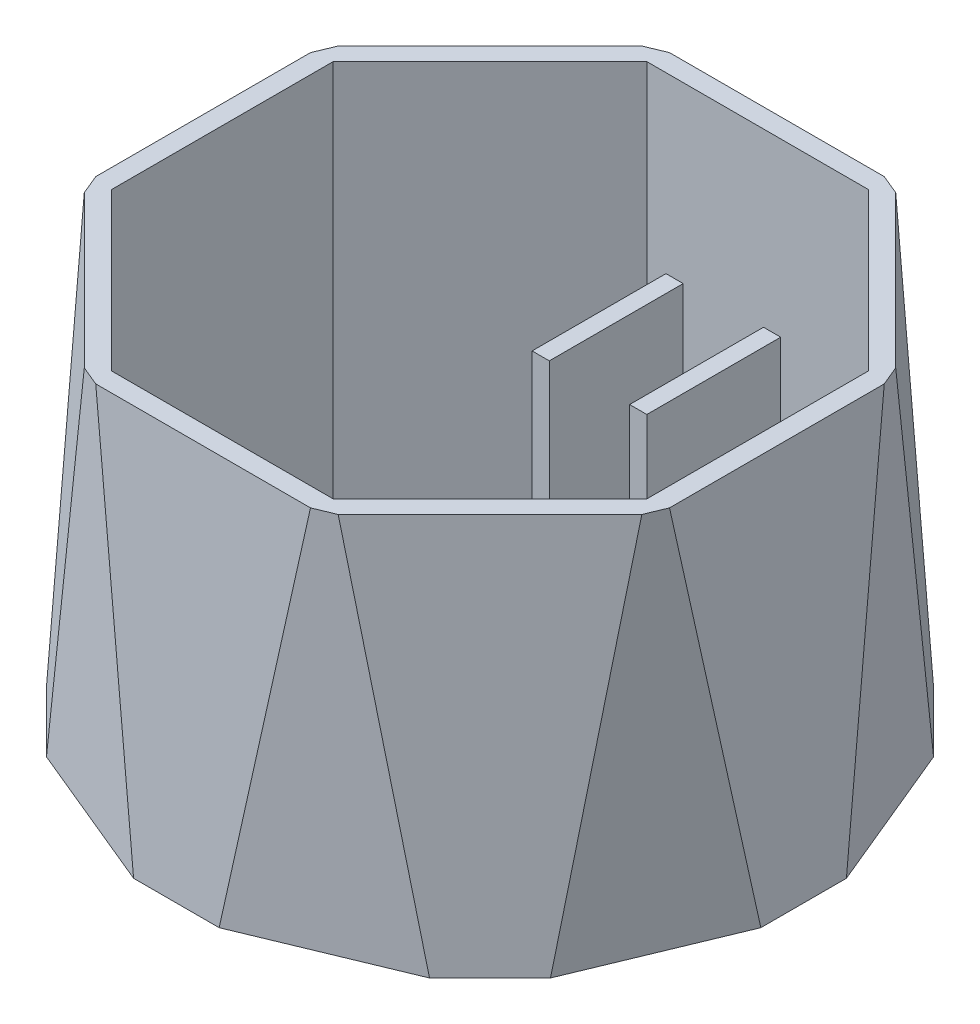
ISO-10303-21;
HEADER;
FILE_DESCRIPTION(('STEP AP214'),'2;1');
FILE_NAME('part.step','',(''),(''),'','','');
FILE_SCHEMA(('AUTOMOTIVE_DESIGN { 1 0 10303 214 1 1 1 1 }'));
ENDSEC;
DATA;
#1=APPLICATION_CONTEXT('core data for automotive mechanical design processes');
#2=APPLICATION_PROTOCOL_DEFINITION('international standard','automotive_design',2000,#1);
#3=PRODUCT_CONTEXT('',#1,'mechanical');
#4=PRODUCT('Part','Part','',(#3));
#5=PRODUCT_RELATED_PRODUCT_CATEGORY('part','',(#4));
#6=PRODUCT_DEFINITION_FORMATION('','',#4);
#7=PRODUCT_DEFINITION_CONTEXT('part definition',#1,'design');
#8=PRODUCT_DEFINITION('design','',#6,#7);
#9=PRODUCT_DEFINITION_SHAPE('','',#8);
#10=(LENGTH_UNIT() NAMED_UNIT(*) SI_UNIT(.MILLI.,.METRE.));
#11=(NAMED_UNIT(*) PLANE_ANGLE_UNIT() SI_UNIT($,.RADIAN.));
#12=(NAMED_UNIT(*) SI_UNIT($,.STERADIAN.) SOLID_ANGLE_UNIT());
#13=UNCERTAINTY_MEASURE_WITH_UNIT(LENGTH_MEASURE(1.E-05),#10,'distance_accuracy_value','');
#14=(GEOMETRIC_REPRESENTATION_CONTEXT(3) GLOBAL_UNCERTAINTY_ASSIGNED_CONTEXT((#13)) GLOBAL_UNIT_ASSIGNED_CONTEXT((#10,
#11,#12)) REPRESENTATION_CONTEXT('',''));
#15=CARTESIAN_POINT('',(0.,0.,0.));
#16=DIRECTION('',(0.,0.,1.));
#17=DIRECTION('',(1.,0.,0.));
#18=AXIS2_PLACEMENT_3D('',#15,#16,#17);
#19=CARTESIAN_POINT('',(0.,100.,-70.));
#20=DIRECTION('',(0.,0.,1.));
#21=DIRECTION('',(1.,0.,0.));
#22=AXIS2_PLACEMENT_3D('',#19,#20,#21);
#23=PLANE('',#22);
#24=DIRECTION('',(-1.,0.,0.));
#25=VECTOR('',#24,1.);
#26=CARTESIAN_POINT('',(6.00505063388332,55.1108574848862,-70.));
#27=LINE('',#26,#25);
#28=CARTESIAN_POINT('',(6.00505063388332,55.1108574848862,-70.));
#29=VERTEX_POINT('',#28);
#30=CARTESIAN_POINT('',(1.50505063388332,55.1108574848862,-70.));
#31=VERTEX_POINT('',#30);
#32=EDGE_CURVE('E878',#29,#31,#27,.T.);
#33=ORIENTED_EDGE('',*,*,#32,.F.);
#34=DIRECTION('',(0.,1.,0.));
#35=VECTOR('',#34,1.);
#36=CARTESIAN_POINT('',(6.00505063388332,0.610857484886179,-70.));
#37=LINE('',#36,#35);
#38=CARTESIAN_POINT('',(6.00505063388332,0.610857484886179,-70.));
#39=VERTEX_POINT('',#38);
#40=EDGE_CURVE('E881',#39,#29,#37,.T.);
#41=ORIENTED_EDGE('',*,*,#40,.F.);
#42=DIRECTION('',(1.,0.,0.));
#43=VECTOR('',#42,1.);
#44=CARTESIAN_POINT('',(6.00505063388332,0.610857484886179,-70.));
#45=LINE('',#44,#43);
#46=CARTESIAN_POINT('',(1.50505063388332,0.610857484886179,-70.));
#47=VERTEX_POINT('',#46);
#48=EDGE_CURVE('E871',#47,#39,#45,.T.);
#49=ORIENTED_EDGE('',*,*,#48,.F.);
#50=DIRECTION('',(0.,-1.,0.));
#51=VECTOR('',#50,1.);
#52=CARTESIAN_POINT('',(1.50505063388332,0.610857484886179,-70.));
#53=LINE('',#52,#51);
#54=EDGE_CURVE('E874',#31,#47,#53,.T.);
#55=ORIENTED_EDGE('',*,*,#54,.F.);
#56=EDGE_LOOP('',(#33,#41,#49,#55));
#57=FACE_BOUND('',#56,.T.);
#58=DIRECTION('',(-1.,0.,0.));
#59=VECTOR('',#58,1.);
#60=CARTESIAN_POINT('',(0.,0.,-70.));
#61=LINE('',#60,#59);
#62=CARTESIAN_POINT('',(-23.9949493661167,0.,-70.));
#63=VERTEX_POINT('',#62);
#64=CARTESIAN_POINT('',(-28.9949493661167,0.,-70.));
#65=VERTEX_POINT('',#64);
#66=EDGE_CURVE('E346',#63,#65,#61,.T.);
#67=ORIENTED_EDGE('',*,*,#66,.F.);
#68=DIRECTION('',(0.,-1.,0.));
#69=VECTOR('',#68,1.);
#70=CARTESIAN_POINT('',(-23.9949493661167,0.,-70.));
#71=LINE('',#70,#69);
#72=CARTESIAN_POINT('',(-23.9949493661167,54.5,-70.));
#73=VERTEX_POINT('',#72);
#74=EDGE_CURVE('E849',#73,#63,#71,.T.);
#75=ORIENTED_EDGE('',*,*,#74,.F.);
#76=DIRECTION('',(-1.,0.,0.));
#77=VECTOR('',#76,1.);
#78=CARTESIAN_POINT('',(-23.9949493661167,54.5,-70.));
#79=LINE('',#78,#77);
#80=CARTESIAN_POINT('',(-19.4949493661167,54.5,-70.));
#81=VERTEX_POINT('',#80);
#82=EDGE_CURVE('E846',#81,#73,#79,.T.);
#83=ORIENTED_EDGE('',*,*,#82,.F.);
#84=DIRECTION('',(0.,1.,0.));
#85=VECTOR('',#84,1.);
#86=CARTESIAN_POINT('',(-19.4949493661167,0.,-70.));
#87=LINE('',#86,#85);
#88=CARTESIAN_POINT('',(-19.4949493661167,0.,-70.));
#89=VERTEX_POINT('',#88);
#90=EDGE_CURVE('E948',#89,#81,#87,.T.);
#91=ORIENTED_EDGE('',*,*,#90,.F.);
#92=CARTESIAN_POINT('',(28.9949493661166,0.,-70.));
#93=VERTEX_POINT('',#92);
#94=EDGE_CURVE('E347',#93,#89,#61,.T.);
#95=ORIENTED_EDGE('',*,*,#94,.F.);
#96=DIRECTION('',(0.,-1.,0.));
#97=VECTOR('',#96,1.);
#98=CARTESIAN_POINT('',(28.9949493661166,100.,-70.));
#99=LINE('',#98,#97);
#100=CARTESIAN_POINT('',(28.9949493661166,100.,-70.));
#101=VERTEX_POINT('',#100);
#102=EDGE_CURVE('E365',#101,#93,#99,.T.);
#103=ORIENTED_EDGE('',*,*,#102,.F.);
#104=DIRECTION('',(-1.,0.,0.));
#105=VECTOR('',#104,1.);
#106=CARTESIAN_POINT('',(0.,100.,-70.));
#107=LINE('',#106,#105);
#108=CARTESIAN_POINT('',(-28.9949493661167,100.,-70.));
#109=VERTEX_POINT('',#108);
#110=EDGE_CURVE('E914',#101,#109,#107,.T.);
#111=ORIENTED_EDGE('',*,*,#110,.T.);
#112=DIRECTION('',(0.,-1.,0.));
#113=VECTOR('',#112,1.);
#114=CARTESIAN_POINT('',(-28.9949493661167,100.,-70.));
#115=LINE('',#114,#113);
#116=EDGE_CURVE('E369',#109,#65,#115,.T.);
#117=ORIENTED_EDGE('',*,*,#116,.T.);
#118=EDGE_LOOP('',(#67,#75,#83,#91,#95,#103,#111,#117));
#119=FACE_BOUND('',#118,.T.);
#120=ADVANCED_FACE('F49',(#57,#119),#23,.T.);
#121=CARTESIAN_POINT('',(0.,100.,75.));
#122=DIRECTION('',(0.,0.0697564737441255,0.997564050259824));
#123=DIRECTION('',(0.,-0.997564050259824,0.0697564737441255));
#124=AXIS2_PLACEMENT_3D('',#121,#122,#123);
#125=PLANE('',#124);
#126=DIRECTION('',(1.,0.,0.));
#127=VECTOR('',#126,1.);
#128=CARTESIAN_POINT('',(0.,100.,75.));
#129=LINE('',#128,#127);
#130=CARTESIAN_POINT('',(-28.0660171779821,100.,75.));
#131=VERTEX_POINT('',#130);
#132=CARTESIAN_POINT('',(28.0660171779821,100.,75.));
#133=VERTEX_POINT('',#132);
#134=EDGE_CURVE('E422',#131,#133,#129,.T.);
#135=ORIENTED_EDGE('',*,*,#134,.F.);
#136=DIRECTION('',(0.166068560234038,-0.983712084404491,0.0687878499327116));
#137=VECTOR('',#136,1.);
#138=CARTESIAN_POINT('',(-28.0660171779821,100.,75.));
#139=LINE('',#138,#137);
#140=CARTESIAN_POINT('',(-11.1841914012285,0.,81.9926811943511));
#141=VERTEX_POINT('',#140);
#142=EDGE_CURVE('E258',#131,#141,#139,.T.);
#143=ORIENTED_EDGE('',*,*,#142,.T.);
#144=DIRECTION('',(-1.,0.,0.));
#145=VECTOR('',#144,1.);
#146=CARTESIAN_POINT('',(0.,0.,81.9926811943511));
#147=LINE('',#146,#145);
#148=CARTESIAN_POINT('',(11.1841914012283,0.,81.9926811943511));
#149=VERTEX_POINT('',#148);
#150=EDGE_CURVE('E262',#141,#149,#147,.F.);
#151=ORIENTED_EDGE('',*,*,#150,.T.);
#152=DIRECTION('',(0.166068560234039,0.983712084404491,-0.0687878499327117));
#153=VECTOR('',#152,1.);
#154=CARTESIAN_POINT('',(28.2314897781713,100.980181897251,74.9314590048005));
#155=LINE('',#154,#153);
#156=EDGE_CURVE('E266',#149,#133,#155,.T.);
#157=ORIENTED_EDGE('',*,*,#156,.T.);
#158=EDGE_LOOP('',(#135,#143,#151,#157));
#159=FACE_BOUND('',#158,.T.);
#160=ADVANCED_FACE('F437',(#159),#125,.T.);
#161=CARTESIAN_POINT('',(53.0330085889911,100.,53.0330085889911));
#162=DIRECTION('',(0.70538430460664,0.0697564737441255,0.70538430460664));
#163=DIRECTION('',(0.707106781186548,0.,-0.707106781186548));
#164=AXIS2_PLACEMENT_3D('',#161,#162,#163);
#165=PLANE('',#164);
#166=DIRECTION('',(0.707106781186547,0.,-0.707106781186548));
#167=VECTOR('',#166,1.);
#168=CARTESIAN_POINT('',(53.0330085889911,100.,53.0330085889911));
#169=LINE('',#168,#167);
#170=CARTESIAN_POINT('',(33.1873375215418,100.,72.8786796564403));
#171=VERTEX_POINT('',#170);
#172=CARTESIAN_POINT('',(72.8786796564404,100.,33.1873375215418));
#173=VERTEX_POINT('',#172);
#174=EDGE_CURVE('E419',#171,#173,#169,.T.);
#175=ORIENTED_EDGE('',*,*,#174,.F.);
#176=DIRECTION('',(0.166068560234037,-0.983712084404491,-0.0687878499327106));
#177=VECTOR('',#176,1.);
#178=CARTESIAN_POINT('',(33.1873375215418,100.,72.8786796564403));
#179=LINE('',#178,#177);
#180=CARTESIAN_POINT('',(50.0691632982953,0.,65.8859984620894));
#181=VERTEX_POINT('',#180);
#182=EDGE_CURVE('E250',#171,#181,#179,.T.);
#183=ORIENTED_EDGE('',*,*,#182,.T.);
#184=DIRECTION('',(-0.707106781186548,0.,0.707106781186548));
#185=VECTOR('',#184,1.);
#186=CARTESIAN_POINT('',(57.9775808801924,0.,57.9775808801923));
#187=LINE('',#186,#185);
#188=CARTESIAN_POINT('',(65.8859984620894,0.,50.0691632982953));
#189=VERTEX_POINT('',#188);
#190=EDGE_CURVE('E253',#181,#189,#187,.F.);
#191=ORIENTED_EDGE('',*,*,#190,.T.);
#192=DIRECTION('',(0.0687878499327108,0.983712084404491,-0.166068560234037));
#193=VECTOR('',#192,1.);
#194=CARTESIAN_POINT('',(72.9472206516399,100.980181897251,33.0218649213526));
#195=LINE('',#194,#193);
#196=EDGE_CURVE('E255',#189,#173,#195,.T.);
#197=ORIENTED_EDGE('',*,*,#196,.T.);
#198=EDGE_LOOP('',(#175,#183,#191,#197));
#199=FACE_BOUND('',#198,.T.);
#200=ADVANCED_FACE('F427',(#199),#165,.T.);
#201=CARTESIAN_POINT('',(75.,100.,0.));
#202=DIRECTION('',(0.997564050259824,0.0697564737441255,0.));
#203=DIRECTION('',(-0.0697564737441255,0.997564050259824,0.));
#204=AXIS2_PLACEMENT_3D('',#201,#202,#203);
#205=PLANE('',#204);
#206=DIRECTION('',(0.,0.,-1.));
#207=VECTOR('',#206,1.);
#208=CARTESIAN_POINT('',(75.,100.,0.));
#209=LINE('',#208,#207);
#210=CARTESIAN_POINT('',(75.,100.,28.0660171779821));
#211=VERTEX_POINT('',#210);
#212=CARTESIAN_POINT('',(75.,100.,-28.0660171779822));
#213=VERTEX_POINT('',#212);
#214=EDGE_CURVE('E431',#211,#213,#209,.T.);
#215=ORIENTED_EDGE('',*,*,#214,.F.);
#216=DIRECTION('',(0.0687878499327115,-0.983712084404491,-0.166068560234039));
#217=VECTOR('',#216,1.);
#218=CARTESIAN_POINT('',(75.,100.,28.0660171779821));
#219=LINE('',#218,#217);
#220=CARTESIAN_POINT('',(81.9926811943511,0.,11.1841914012284));
#221=VERTEX_POINT('',#220);
#222=EDGE_CURVE('E11',#211,#221,#219,.T.);
#223=ORIENTED_EDGE('',*,*,#222,.T.);
#224=DIRECTION('',(0.,0.,1.));
#225=VECTOR('',#224,1.);
#226=CARTESIAN_POINT('',(81.9926811943511,0.,0.));
#227=LINE('',#226,#225);
#228=CARTESIAN_POINT('',(81.9926811943511,0.,-11.1841914012284));
#229=VERTEX_POINT('',#228);
#230=EDGE_CURVE('E239',#221,#229,#227,.F.);
#231=ORIENTED_EDGE('',*,*,#230,.T.);
#232=DIRECTION('',(-0.0687878499327117,0.983712084404491,-0.166068560234039));
#233=VECTOR('',#232,1.);
#234=CARTESIAN_POINT('',(74.9314590048005,100.980181897251,-28.2314897781714));
#235=LINE('',#234,#233);
#236=EDGE_CURVE('E60',#229,#213,#235,.T.);
#237=ORIENTED_EDGE('',*,*,#236,.T.);
#238=EDGE_LOOP('',(#215,#223,#231,#237));
#239=FACE_BOUND('',#238,.T.);
#240=ADVANCED_FACE('F51',(#239),#205,.T.);
#241=CARTESIAN_POINT('',(53.0330085889911,100.,-53.0330085889911));
#242=DIRECTION('',(0.705384304606639,0.0697564737441255,-0.70538430460664));
#243=DIRECTION('',(-0.707106781186548,0.,-0.707106781186547));
#244=AXIS2_PLACEMENT_3D('',#241,#242,#243);
#245=PLANE('',#244);
#246=DIRECTION('',(0.707106781186548,0.,0.707106781186547));
#247=VECTOR('',#246,1.);
#248=CARTESIAN_POINT('',(57.9775808801923,0.,-57.9775808801924));
#249=LINE('',#248,#247);
#250=CARTESIAN_POINT('',(65.8859984620894,0.,-50.0691632982953));
#251=VERTEX_POINT('',#250);
#252=CARTESIAN_POINT('',(50.0691632982954,0.,-65.8859984620893));
#253=VERTEX_POINT('',#252);
#254=EDGE_CURVE('E234',#251,#253,#249,.F.);
#255=ORIENTED_EDGE('',*,*,#254,.T.);
#256=DIRECTION('',(-0.166068560234038,0.983712084404491,-0.0687878499327116));
#257=VECTOR('',#256,1.);
#258=CARTESIAN_POINT('',(33.0218649213525,100.980181897251,-72.9472206516399));
#259=LINE('',#258,#257);
#260=CARTESIAN_POINT('',(33.1873375215418,100.,-72.8786796564404));
#261=VERTEX_POINT('',#260);
#262=EDGE_CURVE('E244',#253,#261,#259,.T.);
#263=ORIENTED_EDGE('',*,*,#262,.T.);
#264=DIRECTION('',(-0.707106781186548,0.,-0.707106781186547));
#265=VECTOR('',#264,1.);
#266=CARTESIAN_POINT('',(53.0330085889911,100.,-53.0330085889911));
#267=LINE('',#266,#265);
#268=CARTESIAN_POINT('',(72.8786796564404,100.,-33.1873375215418));
#269=VERTEX_POINT('',#268);
#270=EDGE_CURVE('E318',#269,#261,#267,.T.);
#271=ORIENTED_EDGE('',*,*,#270,.F.);
#272=DIRECTION('',(-0.068787849932711,-0.983712084404491,-0.166068560234037));
#273=VECTOR('',#272,1.);
#274=CARTESIAN_POINT('',(72.8786796564404,100.,-33.1873375215418));
#275=LINE('',#274,#273);
#276=EDGE_CURVE('E240',#269,#251,#275,.T.);
#277=ORIENTED_EDGE('',*,*,#276,.T.);
#278=EDGE_LOOP('',(#255,#263,#271,#277));
#279=FACE_BOUND('',#278,.T.);
#280=ADVANCED_FACE('F539',(#279),#245,.T.);
#281=CARTESIAN_POINT('',(0.,100.,-75.));
#282=DIRECTION('',(0.,0.0697564737441255,-0.997564050259824));
#283=DIRECTION('',(0.,0.997564050259824,0.0697564737441255));
#284=AXIS2_PLACEMENT_3D('',#281,#282,#283);
#285=PLANE('',#284);
#286=DIRECTION('',(-1.,0.,0.));
#287=VECTOR('',#286,1.);
#288=CARTESIAN_POINT('',(0.,100.,-75.));
#289=LINE('',#288,#287);
#290=CARTESIAN_POINT('',(28.0660171779821,100.,-75.));
#291=VERTEX_POINT('',#290);
#292=CARTESIAN_POINT('',(-28.0660171779822,100.,-75.));
#293=VERTEX_POINT('',#292);
#294=EDGE_CURVE('E311',#291,#293,#289,.T.);
#295=ORIENTED_EDGE('',*,*,#294,.F.);
#296=DIRECTION('',(-0.166068560234038,-0.983712084404491,-0.0687878499327116));
#297=VECTOR('',#296,1.);
#298=CARTESIAN_POINT('',(28.0660171779821,100.,-75.));
#299=LINE('',#298,#297);
#300=CARTESIAN_POINT('',(11.1841914012285,0.,-81.9926811943511));
#301=VERTEX_POINT('',#300);
#302=EDGE_CURVE('E53',#291,#301,#299,.T.);
#303=ORIENTED_EDGE('',*,*,#302,.T.);
#304=DIRECTION('',(1.,0.,0.));
#305=VECTOR('',#304,1.);
#306=CARTESIAN_POINT('',(0.,0.,-81.9926811943511));
#307=LINE('',#306,#305);
#308=CARTESIAN_POINT('',(-11.1841914012287,0.,-81.9926811943511));
#309=VERTEX_POINT('',#308);
#310=EDGE_CURVE('E238',#301,#309,#307,.F.);
#311=ORIENTED_EDGE('',*,*,#310,.T.);
#312=DIRECTION('',(-0.166068560234037,0.983712084404491,0.0687878499327117));
#313=VECTOR('',#312,1.);
#314=CARTESIAN_POINT('',(-28.2314897781714,100.980181897251,-74.9314590048005));
#315=LINE('',#314,#313);
#316=EDGE_CURVE('E297',#309,#293,#315,.T.);
#317=ORIENTED_EDGE('',*,*,#316,.T.);
#318=EDGE_LOOP('',(#295,#303,#311,#317));
#319=FACE_BOUND('',#318,.T.);
#320=ADVANCED_FACE('F304',(#319),#285,.T.);
#321=CARTESIAN_POINT('',(-53.0330085889911,100.,-53.0330085889911));
#322=DIRECTION('',(-0.70538430460664,0.0697564737441255,-0.705384304606639));
#323=DIRECTION('',(-0.707106781186547,0.,0.707106781186548));
#324=AXIS2_PLACEMENT_3D('',#321,#322,#323);
#325=PLANE('',#324);
#326=DIRECTION('',(-0.707106781186547,0.,0.707106781186548));
#327=VECTOR('',#326,1.);
#328=CARTESIAN_POINT('',(-53.0330085889911,100.,-53.0330085889911));
#329=LINE('',#328,#327);
#330=CARTESIAN_POINT('',(-33.1873375215418,100.,-72.8786796564404));
#331=VERTEX_POINT('',#330);
#332=CARTESIAN_POINT('',(-72.8786796564404,100.,-33.1873375215418));
#333=VERTEX_POINT('',#332);
#334=EDGE_CURVE('E211',#331,#333,#329,.T.);
#335=ORIENTED_EDGE('',*,*,#334,.F.);
#336=DIRECTION('',(-0.166068560234038,-0.983712084404491,0.0687878499327122));
#337=VECTOR('',#336,1.);
#338=CARTESIAN_POINT('',(-33.1873375215418,100.,-72.8786796564404));
#339=LINE('',#338,#337);
#340=CARTESIAN_POINT('',(-50.0691632982955,0.,-65.8859984620892));
#341=VERTEX_POINT('',#340);
#342=EDGE_CURVE('E200',#331,#341,#339,.T.);
#343=ORIENTED_EDGE('',*,*,#342,.T.);
#344=DIRECTION('',(0.707106781186547,0.,-0.707106781186548));
#345=VECTOR('',#344,1.);
#346=CARTESIAN_POINT('',(-57.9775808801924,0.,-57.9775808801923));
#347=LINE('',#346,#345);
#348=CARTESIAN_POINT('',(-65.8859984620894,0.,-50.0691632982953));
#349=VERTEX_POINT('',#348);
#350=EDGE_CURVE('E286',#341,#349,#347,.F.);
#351=ORIENTED_EDGE('',*,*,#350,.T.);
#352=DIRECTION('',(-0.0687878499327108,0.983712084404491,0.166068560234037));
#353=VECTOR('',#352,1.);
#354=CARTESIAN_POINT('',(-72.9472206516399,100.980181897251,-33.0218649213525));
#355=LINE('',#354,#353);
#356=EDGE_CURVE('E233',#349,#333,#355,.T.);
#357=ORIENTED_EDGE('',*,*,#356,.T.);
#358=EDGE_LOOP('',(#335,#343,#351,#357));
#359=FACE_BOUND('',#358,.T.);
#360=ADVANCED_FACE('F313',(#359),#325,.T.);
#361=CARTESIAN_POINT('',(-75.,100.,0.));
#362=DIRECTION('',(-0.997564050259824,0.0697564737441255,0.));
#363=DIRECTION('',(-0.0697564737441255,-0.997564050259824,0.));
#364=AXIS2_PLACEMENT_3D('',#361,#362,#363);
#365=PLANE('',#364);
#366=DIRECTION('',(0.,0.,1.));
#367=VECTOR('',#366,1.);
#368=CARTESIAN_POINT('',(-75.,100.,0.));
#369=LINE('',#368,#367);
#370=CARTESIAN_POINT('',(-75.,100.,-28.0660171779821));
#371=VERTEX_POINT('',#370);
#372=CARTESIAN_POINT('',(-75.,100.,28.0660171779821));
#373=VERTEX_POINT('',#372);
#374=EDGE_CURVE('E192',#371,#373,#369,.T.);
#375=ORIENTED_EDGE('',*,*,#374,.F.);
#376=DIRECTION('',(-0.0687878499327116,-0.983712084404491,0.166068560234039));
#377=VECTOR('',#376,1.);
#378=CARTESIAN_POINT('',(-75.,100.,-28.0660171779821));
#379=LINE('',#378,#377);
#380=CARTESIAN_POINT('',(-81.9926811943511,0.,-11.1841914012284));
#381=VERTEX_POINT('',#380);
#382=EDGE_CURVE('E199',#371,#381,#379,.T.);
#383=ORIENTED_EDGE('',*,*,#382,.T.);
#384=DIRECTION('',(0.,0.,-1.));
#385=VECTOR('',#384,1.);
#386=CARTESIAN_POINT('',(-81.9926811943511,0.,0.));
#387=LINE('',#386,#385);
#388=CARTESIAN_POINT('',(-81.9926811943511,0.,11.1841914012284));
#389=VERTEX_POINT('',#388);
#390=EDGE_CURVE('E195',#381,#389,#387,.F.);
#391=ORIENTED_EDGE('',*,*,#390,.T.);
#392=DIRECTION('',(0.0687878499327117,0.983712084404491,0.166068560234039));
#393=VECTOR('',#392,1.);
#394=CARTESIAN_POINT('',(-74.9314590048005,100.980181897251,28.2314897781714));
#395=LINE('',#394,#393);
#396=EDGE_CURVE('E188',#389,#373,#395,.T.);
#397=ORIENTED_EDGE('',*,*,#396,.T.);
#398=EDGE_LOOP('',(#375,#383,#391,#397));
#399=FACE_BOUND('',#398,.T.);
#400=ADVANCED_FACE('F190',(#399),#365,.T.);
#401=CARTESIAN_POINT('',(49.4974746830583,100.,49.4974746830583));
#402=DIRECTION('',(-0.707106781186548,0.,-0.707106781186547));
#403=DIRECTION('',(-0.707106781186547,0.,0.707106781186548));
#404=AXIS2_PLACEMENT_3D('',#401,#402,#403);
#405=PLANE('',#404);
#406=DIRECTION('',(0.707106781186547,0.,-0.707106781186548));
#407=VECTOR('',#406,1.);
#408=CARTESIAN_POINT('',(49.4974746830583,0.,49.4974746830583));
#409=LINE('',#408,#407);
#410=CARTESIAN_POINT('',(28.9949493661167,0.,70.));
#411=VERTEX_POINT('',#410);
#412=CARTESIAN_POINT('',(70.,0.,28.9949493661166));
#413=VERTEX_POINT('',#412);
#414=EDGE_CURVE('E325',#411,#413,#409,.T.);
#415=ORIENTED_EDGE('',*,*,#414,.F.);
#416=DIRECTION('',(0.,-1.,0.));
#417=VECTOR('',#416,1.);
#418=CARTESIAN_POINT('',(28.9949493661167,100.,70.));
#419=LINE('',#418,#417);
#420=CARTESIAN_POINT('',(28.9949493661167,100.,70.));
#421=VERTEX_POINT('',#420);
#422=EDGE_CURVE('E299',#421,#411,#419,.T.);
#423=ORIENTED_EDGE('',*,*,#422,.F.);
#424=DIRECTION('',(0.707106781186547,0.,-0.707106781186548));
#425=VECTOR('',#424,1.);
#426=CARTESIAN_POINT('',(49.4974746830583,100.,49.4974746830583));
#427=LINE('',#426,#425);
#428=CARTESIAN_POINT('',(70.,100.,28.9949493661166));
#429=VERTEX_POINT('',#428);
#430=EDGE_CURVE('E281',#421,#429,#427,.T.);
#431=ORIENTED_EDGE('',*,*,#430,.T.);
#432=DIRECTION('',(0.,-1.,0.));
#433=VECTOR('',#432,1.);
#434=CARTESIAN_POINT('',(70.,100.,28.9949493661166));
#435=LINE('',#434,#433);
#436=EDGE_CURVE('E324',#429,#413,#435,.T.);
#437=ORIENTED_EDGE('',*,*,#436,.T.);
#438=EDGE_LOOP('',(#415,#423,#431,#437));
#439=FACE_BOUND('',#438,.T.);
#440=ADVANCED_FACE('F486',(#439),#405,.T.);
#441=CARTESIAN_POINT('',(0.,100.,70.));
#442=DIRECTION('',(0.,0.,-1.));
#443=DIRECTION('',(-1.,0.,0.));
#444=AXIS2_PLACEMENT_3D('',#441,#442,#443);
#445=PLANE('',#444);
#446=DIRECTION('',(1.,0.,0.));
#447=VECTOR('',#446,1.);
#448=CARTESIAN_POINT('',(0.,0.,70.));
#449=LINE('',#448,#447);
#450=CARTESIAN_POINT('',(-28.9949493661167,0.,70.));
#451=VERTEX_POINT('',#450);
#452=EDGE_CURVE('E329',#451,#411,#449,.T.);
#453=ORIENTED_EDGE('',*,*,#452,.F.);
#454=DIRECTION('',(0.,-1.,0.));
#455=VECTOR('',#454,1.);
#456=CARTESIAN_POINT('',(-28.9949493661167,100.,70.));
#457=LINE('',#456,#455);
#458=CARTESIAN_POINT('',(-28.9949493661167,100.,70.));
#459=VERTEX_POINT('',#458);
#460=EDGE_CURVE('E381',#459,#451,#457,.T.);
#461=ORIENTED_EDGE('',*,*,#460,.F.);
#462=DIRECTION('',(1.,0.,0.));
#463=VECTOR('',#462,1.);
#464=CARTESIAN_POINT('',(0.,100.,70.));
#465=LINE('',#464,#463);
#466=EDGE_CURVE('E898',#459,#421,#465,.T.);
#467=ORIENTED_EDGE('',*,*,#466,.T.);
#468=ORIENTED_EDGE('',*,*,#422,.T.);
#469=EDGE_LOOP('',(#453,#461,#467,#468));
#470=FACE_BOUND('',#469,.T.);
#471=ADVANCED_FACE('F482',(#470),#445,.T.);
#472=CARTESIAN_POINT('',(-49.4974746830583,100.,49.4974746830584));
#473=DIRECTION('',(0.707106781186547,0.,-0.707106781186548));
#474=DIRECTION('',(-0.707106781186548,0.,-0.707106781186547));
#475=AXIS2_PLACEMENT_3D('',#472,#473,#474);
#476=PLANE('',#475);
#477=DIRECTION('',(0.707106781186548,0.,0.707106781186547));
#478=VECTOR('',#477,1.);
#479=CARTESIAN_POINT('',(-49.4974746830583,0.,49.4974746830584));
#480=LINE('',#479,#478);
#481=CARTESIAN_POINT('',(-70.,0.,28.9949493661167));
#482=VERTEX_POINT('',#481);
#483=EDGE_CURVE('E334',#482,#451,#480,.T.);
#484=ORIENTED_EDGE('',*,*,#483,.F.);
#485=DIRECTION('',(0.,-1.,0.));
#486=VECTOR('',#485,1.);
#487=CARTESIAN_POINT('',(-70.,100.,28.9949493661167));
#488=LINE('',#487,#486);
#489=CARTESIAN_POINT('',(-70.,100.,28.9949493661167));
#490=VERTEX_POINT('',#489);
#491=EDGE_CURVE('E377',#490,#482,#488,.T.);
#492=ORIENTED_EDGE('',*,*,#491,.F.);
#493=DIRECTION('',(0.707106781186548,0.,0.707106781186547));
#494=VECTOR('',#493,1.);
#495=CARTESIAN_POINT('',(-49.4974746830583,100.,49.4974746830584));
#496=LINE('',#495,#494);
#497=EDGE_CURVE('E902',#490,#459,#496,.T.);
#498=ORIENTED_EDGE('',*,*,#497,.T.);
#499=ORIENTED_EDGE('',*,*,#460,.T.);
#500=EDGE_LOOP('',(#484,#492,#498,#499));
#501=FACE_BOUND('',#500,.T.);
#502=ADVANCED_FACE('F478',(#501),#476,.T.);
#503=CARTESIAN_POINT('',(-70.,100.,0.));
#504=DIRECTION('',(1.,0.,0.));
#505=DIRECTION('',(0.,0.,-1.));
#506=AXIS2_PLACEMENT_3D('',#503,#504,#505);
#507=PLANE('',#506);
#508=DIRECTION('',(0.,0.,1.));
#509=VECTOR('',#508,1.);
#510=CARTESIAN_POINT('',(-70.,0.,0.));
#511=LINE('',#510,#509);
#512=CARTESIAN_POINT('',(-70.,0.,-28.9949493661166));
#513=VERTEX_POINT('',#512);
#514=EDGE_CURVE('E338',#513,#482,#511,.T.);
#515=ORIENTED_EDGE('',*,*,#514,.F.);
#516=DIRECTION('',(0.,-1.,0.));
#517=VECTOR('',#516,1.);
#518=CARTESIAN_POINT('',(-70.,100.,-28.9949493661166));
#519=LINE('',#518,#517);
#520=CARTESIAN_POINT('',(-70.,100.,-28.9949493661166));
#521=VERTEX_POINT('',#520);
#522=EDGE_CURVE('E373',#521,#513,#519,.T.);
#523=ORIENTED_EDGE('',*,*,#522,.F.);
#524=DIRECTION('',(0.,0.,1.));
#525=VECTOR('',#524,1.);
#526=CARTESIAN_POINT('',(-70.,100.,0.));
#527=LINE('',#526,#525);
#528=EDGE_CURVE('E906',#521,#490,#527,.T.);
#529=ORIENTED_EDGE('',*,*,#528,.T.);
#530=ORIENTED_EDGE('',*,*,#491,.T.);
#531=EDGE_LOOP('',(#515,#523,#529,#530));
#532=FACE_BOUND('',#531,.T.);
#533=ADVANCED_FACE('F474',(#532),#507,.T.);
#534=CARTESIAN_POINT('',(-49.4974746830584,100.,-49.4974746830583));
#535=DIRECTION('',(0.707106781186548,0.,0.707106781186547));
#536=DIRECTION('',(0.707106781186547,0.,-0.707106781186548));
#537=AXIS2_PLACEMENT_3D('',#534,#535,#536);
#538=PLANE('',#537);
#539=DIRECTION('',(-0.707106781186547,0.,0.707106781186548));
#540=VECTOR('',#539,1.);
#541=CARTESIAN_POINT('',(-49.4974746830584,0.,-49.4974746830583));
#542=LINE('',#541,#540);
#543=EDGE_CURVE('E342',#65,#513,#542,.T.);
#544=ORIENTED_EDGE('',*,*,#543,.F.);
#545=ORIENTED_EDGE('',*,*,#116,.F.);
#546=DIRECTION('',(-0.707106781186547,0.,0.707106781186548));
#547=VECTOR('',#546,1.);
#548=CARTESIAN_POINT('',(-49.4974746830584,100.,-49.4974746830583));
#549=LINE('',#548,#547);
#550=EDGE_CURVE('E910',#109,#521,#549,.T.);
#551=ORIENTED_EDGE('',*,*,#550,.T.);
#552=ORIENTED_EDGE('',*,*,#522,.T.);
#553=EDGE_LOOP('',(#544,#545,#551,#552));
#554=FACE_BOUND('',#553,.T.);
#555=ADVANCED_FACE('F471',(#554),#538,.T.);
#556=CARTESIAN_POINT('',(49.4974746830583,100.,-49.4974746830583));
#557=DIRECTION('',(-0.707106781186547,0.,0.707106781186548));
#558=DIRECTION('',(0.707106781186548,0.,0.707106781186547));
#559=AXIS2_PLACEMENT_3D('',#556,#557,#558);
#560=PLANE('',#559);
#561=DIRECTION('',(-0.707106781186548,0.,-0.707106781186547));
#562=VECTOR('',#561,1.);
#563=CARTESIAN_POINT('',(49.4974746830583,0.,-49.4974746830583));
#564=LINE('',#563,#562);
#565=CARTESIAN_POINT('',(70.,0.,-28.9949493661167));
#566=VERTEX_POINT('',#565);
#567=EDGE_CURVE('E351',#566,#93,#564,.T.);
#568=ORIENTED_EDGE('',*,*,#567,.F.);
#569=DIRECTION('',(0.,-1.,0.));
#570=VECTOR('',#569,1.);
#571=CARTESIAN_POINT('',(70.,100.,-28.9949493661167));
#572=LINE('',#571,#570);
#573=CARTESIAN_POINT('',(70.,100.,-28.9949493661167));
#574=VERTEX_POINT('',#573);
#575=EDGE_CURVE('E361',#574,#566,#572,.T.);
#576=ORIENTED_EDGE('',*,*,#575,.F.);
#577=DIRECTION('',(-0.707106781186548,0.,-0.707106781186547));
#578=VECTOR('',#577,1.);
#579=CARTESIAN_POINT('',(49.4974746830583,100.,-49.4974746830583));
#580=LINE('',#579,#578);
#581=EDGE_CURVE('E918',#574,#101,#580,.T.);
#582=ORIENTED_EDGE('',*,*,#581,.T.);
#583=ORIENTED_EDGE('',*,*,#102,.T.);
#584=EDGE_LOOP('',(#568,#576,#582,#583));
#585=FACE_BOUND('',#584,.T.);
#586=ADVANCED_FACE('F455',(#585),#560,.T.);
#587=CARTESIAN_POINT('',(70.,100.,0.));
#588=DIRECTION('',(-1.,0.,0.));
#589=DIRECTION('',(0.,0.,1.));
#590=AXIS2_PLACEMENT_3D('',#587,#588,#589);
#591=PLANE('',#590);
#592=DIRECTION('',(0.,0.,-1.));
#593=VECTOR('',#592,1.);
#594=CARTESIAN_POINT('',(70.,0.,0.));
#595=LINE('',#594,#593);
#596=EDGE_CURVE('E272',#413,#566,#595,.T.);
#597=ORIENTED_EDGE('',*,*,#596,.F.);
#598=ORIENTED_EDGE('',*,*,#436,.F.);
#599=DIRECTION('',(0.,0.,-1.));
#600=VECTOR('',#599,1.);
#601=CARTESIAN_POINT('',(70.,100.,0.));
#602=LINE('',#601,#600);
#603=EDGE_CURVE('E921',#429,#574,#602,.T.);
#604=ORIENTED_EDGE('',*,*,#603,.T.);
#605=ORIENTED_EDGE('',*,*,#575,.T.);
#606=EDGE_LOOP('',(#597,#598,#604,#605));
#607=FACE_BOUND('',#606,.T.);
#608=ADVANCED_FACE('F445',(#607),#591,.T.);
#609=CARTESIAN_POINT('',(-53.0330085889911,100.,53.0330085889911));
#610=DIRECTION('',(-0.705384304606639,0.0697564737441255,0.70538430460664));
#611=DIRECTION('',(0.707106781186548,0.,0.707106781186547));
#612=AXIS2_PLACEMENT_3D('',#609,#610,#611);
#613=PLANE('',#612);
#614=DIRECTION('',(0.707106781186548,0.,0.707106781186547));
#615=VECTOR('',#614,1.);
#616=CARTESIAN_POINT('',(-53.0330085889911,100.,53.0330085889911));
#617=LINE('',#616,#615);
#618=CARTESIAN_POINT('',(-72.8786796564404,100.,33.1873375215418));
#619=VERTEX_POINT('',#618);
#620=CARTESIAN_POINT('',(-33.1873375215418,100.,72.8786796564403));
#621=VERTEX_POINT('',#620);
#622=EDGE_CURVE('E210',#619,#621,#617,.T.);
#623=ORIENTED_EDGE('',*,*,#622,.F.);
#624=DIRECTION('',(0.0687878499327108,-0.983712084404491,0.166068560234037));
#625=VECTOR('',#624,1.);
#626=CARTESIAN_POINT('',(-72.8786796564404,100.,33.1873375215418));
#627=LINE('',#626,#625);
#628=CARTESIAN_POINT('',(-65.8859984620894,0.,50.0691632982954));
#629=VERTEX_POINT('',#628);
#630=EDGE_CURVE('E216',#619,#629,#627,.T.);
#631=ORIENTED_EDGE('',*,*,#630,.T.);
#632=DIRECTION('',(-0.707106781186548,0.,-0.707106781186547));
#633=VECTOR('',#632,1.);
#634=CARTESIAN_POINT('',(-57.9775808801924,0.,57.9775808801924));
#635=LINE('',#634,#633);
#636=CARTESIAN_POINT('',(-50.0691632982954,0.,65.8859984620893));
#637=VERTEX_POINT('',#636);
#638=EDGE_CURVE('E278',#629,#637,#635,.F.);
#639=ORIENTED_EDGE('',*,*,#638,.T.);
#640=DIRECTION('',(0.166068560234037,0.983712084404491,0.0687878499327114));
#641=VECTOR('',#640,1.);
#642=CARTESIAN_POINT('',(-33.0218649213526,100.980181897251,72.9472206516399));
#643=LINE('',#642,#641);
#644=EDGE_CURVE('E69',#637,#621,#643,.T.);
#645=ORIENTED_EDGE('',*,*,#644,.T.);
#646=EDGE_LOOP('',(#623,#631,#639,#645));
#647=FACE_BOUND('',#646,.T.);
#648=ADVANCED_FACE('F443',(#647),#613,.T.);
#649=CARTESIAN_POINT('',(0.,100.,0.));
#650=DIRECTION('',(0.,1.,0.));
#651=DIRECTION('',(0.,0.,1.));
#652=AXIS2_PLACEMENT_3D('',#649,#650,#651);
#653=PLANE('',#652);
#654=ORIENTED_EDGE('',*,*,#430,.F.);
#655=ORIENTED_EDGE('',*,*,#466,.F.);
#656=ORIENTED_EDGE('',*,*,#497,.F.);
#657=ORIENTED_EDGE('',*,*,#528,.F.);
#658=ORIENTED_EDGE('',*,*,#550,.F.);
#659=ORIENTED_EDGE('',*,*,#110,.F.);
#660=ORIENTED_EDGE('',*,*,#581,.F.);
#661=ORIENTED_EDGE('',*,*,#603,.F.);
#662=EDGE_LOOP('',(#654,#655,#656,#657,#658,#659,#660,#661));
#663=FACE_BOUND('',#662,.T.);
#664=ORIENTED_EDGE('',*,*,#270,.T.);
#665=DIRECTION('',(0.923879532511287,0.,0.38268343236509));
#666=VECTOR('',#665,1.);
#667=CARTESIAN_POINT('',(30.6266773497619,100.,-73.9393398282202));
#668=LINE('',#667,#666);
#669=EDGE_CURVE('E230',#261,#291,#668,.F.);
#670=ORIENTED_EDGE('',*,*,#669,.T.);
#671=ORIENTED_EDGE('',*,*,#294,.T.);
#672=DIRECTION('',(0.923879532511286,0.,-0.382683432365092));
#673=VECTOR('',#672,1.);
#674=CARTESIAN_POINT('',(-30.6266773497621,100.,-73.9393398282202));
#675=LINE('',#674,#673);
#676=EDGE_CURVE('E222',#293,#331,#675,.F.);
#677=ORIENTED_EDGE('',*,*,#676,.T.);
#678=ORIENTED_EDGE('',*,*,#334,.T.);
#679=DIRECTION('',(0.382683432365087,0.,-0.923879532511288));
#680=VECTOR('',#679,1.);
#681=CARTESIAN_POINT('',(-73.9393398282203,100.,-30.6266773497618));
#682=LINE('',#681,#680);
#683=EDGE_CURVE('E208',#333,#371,#682,.F.);
#684=ORIENTED_EDGE('',*,*,#683,.T.);
#685=ORIENTED_EDGE('',*,*,#374,.T.);
#686=DIRECTION('',(-0.382683432365088,0.,-0.923879532511288));
#687=VECTOR('',#686,1.);
#688=CARTESIAN_POINT('',(-73.9393398282203,100.,30.6266773497618));
#689=LINE('',#688,#687);
#690=EDGE_CURVE('E205',#373,#619,#689,.F.);
#691=ORIENTED_EDGE('',*,*,#690,.T.);
#692=ORIENTED_EDGE('',*,*,#622,.T.);
#693=DIRECTION('',(-0.923879532511287,0.,-0.382683432365089));
#694=VECTOR('',#693,1.);
#695=CARTESIAN_POINT('',(-30.6266773497619,100.,73.9393398282202));
#696=LINE('',#695,#694);
#697=EDGE_CURVE('E218',#621,#131,#696,.F.);
#698=ORIENTED_EDGE('',*,*,#697,.T.);
#699=ORIENTED_EDGE('',*,*,#134,.T.);
#700=DIRECTION('',(-0.923879532511288,0.,0.382683432365087));
#701=VECTOR('',#700,1.);
#702=CARTESIAN_POINT('',(30.6266773497617,100.,73.9393398282203));
#703=LINE('',#702,#701);
#704=EDGE_CURVE('E224',#133,#171,#703,.F.);
#705=ORIENTED_EDGE('',*,*,#704,.T.);
#706=ORIENTED_EDGE('',*,*,#174,.T.);
#707=DIRECTION('',(-0.382683432365088,0.,0.923879532511288));
#708=VECTOR('',#707,1.);
#709=CARTESIAN_POINT('',(73.9393398282203,100.,30.6266773497618));
#710=LINE('',#709,#708);
#711=EDGE_CURVE('E412',#173,#211,#710,.F.);
#712=ORIENTED_EDGE('',*,*,#711,.T.);
#713=ORIENTED_EDGE('',*,*,#214,.T.);
#714=DIRECTION('',(0.382683432365088,0.,0.923879532511288));
#715=VECTOR('',#714,1.);
#716=CARTESIAN_POINT('',(73.9393398282202,100.,-30.6266773497618));
#717=LINE('',#716,#715);
#718=EDGE_CURVE('E247',#213,#269,#717,.F.);
#719=ORIENTED_EDGE('',*,*,#718,.T.);
#720=EDGE_LOOP('',(#664,#670,#671,#677,#678,#684,#685,#691,#692,#698,#699,#705,#706,#712,#713,#719));
#721=FACE_BOUND('',#720,.T.);
#722=ADVANCED_FACE('F204',(#663,#721),#653,.T.);
#723=CARTESIAN_POINT('',(0.,0.,0.));
#724=DIRECTION('',(0.,1.,0.));
#725=DIRECTION('',(0.,0.,1.));
#726=AXIS2_PLACEMENT_3D('',#723,#724,#725);
#727=PLANE('',#726);
#728=ORIENTED_EDGE('',*,*,#414,.T.);
#729=ORIENTED_EDGE('',*,*,#596,.T.);
#730=ORIENTED_EDGE('',*,*,#567,.T.);
#731=ORIENTED_EDGE('',*,*,#94,.T.);
#732=DIRECTION('',(0.,0.,-1.));
#733=VECTOR('',#732,1.);
#734=CARTESIAN_POINT('',(-19.4949493661167,0.,-35.));
#735=LINE('',#734,#733);
#736=CARTESIAN_POINT('',(-19.4949493661167,0.,-35.));
#737=VERTEX_POINT('',#736);
#738=EDGE_CURVE('E834',#737,#89,#735,.T.);
#739=ORIENTED_EDGE('',*,*,#738,.F.);
#740=DIRECTION('',(1.,0.,0.));
#741=VECTOR('',#740,1.);
#742=CARTESIAN_POINT('',(-23.9949493661167,0.,-35.));
#743=LINE('',#742,#741);
#744=CARTESIAN_POINT('',(-23.9949493661167,0.,-35.));
#745=VERTEX_POINT('',#744);
#746=EDGE_CURVE('E830',#745,#737,#743,.T.);
#747=ORIENTED_EDGE('',*,*,#746,.F.);
#748=DIRECTION('',(0.,0.,-1.));
#749=VECTOR('',#748,1.);
#750=CARTESIAN_POINT('',(-23.9949493661167,0.,-35.));
#751=LINE('',#750,#749);
#752=EDGE_CURVE('E330',#745,#63,#751,.T.);
#753=ORIENTED_EDGE('',*,*,#752,.T.);
#754=ORIENTED_EDGE('',*,*,#66,.T.);
#755=ORIENTED_EDGE('',*,*,#543,.T.);
#756=ORIENTED_EDGE('',*,*,#514,.T.);
#757=ORIENTED_EDGE('',*,*,#483,.T.);
#758=ORIENTED_EDGE('',*,*,#452,.T.);
#759=EDGE_LOOP('',(#728,#729,#730,#731,#739,#747,#753,#754,#755,#756,#757,#758));
#760=FACE_BOUND('',#759,.T.);
#761=ORIENTED_EDGE('',*,*,#310,.F.);
#762=DIRECTION('',(-0.923879532511287,0.,-0.38268343236509));
#763=VECTOR('',#762,1.);
#764=CARTESIAN_POINT('',(28.0660171779821,0.,-75.));
#765=LINE('',#764,#763);
#766=EDGE_CURVE('E134',#301,#253,#765,.F.);
#767=ORIENTED_EDGE('',*,*,#766,.T.);
#768=ORIENTED_EDGE('',*,*,#254,.F.);
#769=DIRECTION('',(-0.382683432365088,0.,-0.923879532511288));
#770=VECTOR('',#769,1.);
#771=CARTESIAN_POINT('',(72.8786796564404,0.,-33.1873375215418));
#772=LINE('',#771,#770);
#773=EDGE_CURVE('E388',#251,#229,#772,.F.);
#774=ORIENTED_EDGE('',*,*,#773,.T.);
#775=ORIENTED_EDGE('',*,*,#230,.F.);
#776=DIRECTION('',(0.382683432365088,0.,-0.923879532511288));
#777=VECTOR('',#776,1.);
#778=CARTESIAN_POINT('',(75.,0.,28.0660171779821));
#779=LINE('',#778,#777);
#780=EDGE_CURVE('E391',#221,#189,#779,.F.);
#781=ORIENTED_EDGE('',*,*,#780,.T.);
#782=ORIENTED_EDGE('',*,*,#190,.F.);
#783=DIRECTION('',(0.923879532511288,0.,-0.382683432365087));
#784=VECTOR('',#783,1.);
#785=CARTESIAN_POINT('',(33.1873375215418,0.,72.8786796564403));
#786=LINE('',#785,#784);
#787=EDGE_CURVE('E394',#181,#149,#786,.F.);
#788=ORIENTED_EDGE('',*,*,#787,.T.);
#789=ORIENTED_EDGE('',*,*,#150,.F.);
#790=DIRECTION('',(0.923879532511287,0.,0.382683432365089));
#791=VECTOR('',#790,1.);
#792=CARTESIAN_POINT('',(-28.0660171779821,0.,75.));
#793=LINE('',#792,#791);
#794=EDGE_CURVE('E397',#141,#637,#793,.F.);
#795=ORIENTED_EDGE('',*,*,#794,.T.);
#796=ORIENTED_EDGE('',*,*,#638,.F.);
#797=DIRECTION('',(0.382683432365088,0.,0.923879532511288));
#798=VECTOR('',#797,1.);
#799=CARTESIAN_POINT('',(-72.8786796564404,0.,33.1873375215418));
#800=LINE('',#799,#798);
#801=EDGE_CURVE('E400',#629,#389,#800,.F.);
#802=ORIENTED_EDGE('',*,*,#801,.T.);
#803=ORIENTED_EDGE('',*,*,#390,.F.);
#804=DIRECTION('',(-0.382683432365087,0.,0.923879532511288));
#805=VECTOR('',#804,1.);
#806=CARTESIAN_POINT('',(-75.,0.,-28.0660171779821));
#807=LINE('',#806,#805);
#808=EDGE_CURVE('E403',#381,#349,#807,.F.);
#809=ORIENTED_EDGE('',*,*,#808,.T.);
#810=ORIENTED_EDGE('',*,*,#350,.F.);
#811=DIRECTION('',(-0.923879532511286,0.,0.382683432365092));
#812=VECTOR('',#811,1.);
#813=CARTESIAN_POINT('',(-33.1873375215418,0.,-72.8786796564404));
#814=LINE('',#813,#812);
#815=EDGE_CURVE('E125',#341,#309,#814,.F.);
#816=ORIENTED_EDGE('',*,*,#815,.T.);
#817=EDGE_LOOP('',(#761,#767,#768,#774,#775,#781,#782,#788,#789,#795,#796,#802,#803,#809,#810,#816));
#818=FACE_BOUND('',#817,.T.);
#819=ADVANCED_FACE('F435',(#760,#818),#727,.F.);
#820=CARTESIAN_POINT('',(-23.9949493661167,0.,-35.));
#821=DIRECTION('',(1.,0.,0.));
#822=DIRECTION('',(0.,0.,-1.));
#823=AXIS2_PLACEMENT_3D('',#820,#821,#822);
#824=PLANE('',#823);
#825=ORIENTED_EDGE('',*,*,#74,.T.);
#826=ORIENTED_EDGE('',*,*,#752,.F.);
#827=DIRECTION('',(0.,-1.,0.));
#828=VECTOR('',#827,1.);
#829=CARTESIAN_POINT('',(-23.9949493661167,0.,-35.));
#830=LINE('',#829,#828);
#831=CARTESIAN_POINT('',(-23.9949493661167,54.5,-35.));
#832=VERTEX_POINT('',#831);
#833=EDGE_CURVE('E838',#832,#745,#830,.T.);
#834=ORIENTED_EDGE('',*,*,#833,.F.);
#835=DIRECTION('',(0.,0.,-1.));
#836=VECTOR('',#835,1.);
#837=CARTESIAN_POINT('',(-23.9949493661167,54.5,-35.));
#838=LINE('',#837,#836);
#839=EDGE_CURVE('E959',#832,#73,#838,.T.);
#840=ORIENTED_EDGE('',*,*,#839,.T.);
#841=EDGE_LOOP('',(#825,#826,#834,#840));
#842=FACE_BOUND('',#841,.T.);
#843=ADVANCED_FACE('F657',(#842),#824,.F.);
#844=CARTESIAN_POINT('',(-19.4949493661167,0.,-35.));
#845=DIRECTION('',(-1.,0.,0.));
#846=DIRECTION('',(0.,0.,1.));
#847=AXIS2_PLACEMENT_3D('',#844,#845,#846);
#848=PLANE('',#847);
#849=ORIENTED_EDGE('',*,*,#90,.T.);
#850=DIRECTION('',(0.,0.,-1.));
#851=VECTOR('',#850,1.);
#852=CARTESIAN_POINT('',(-19.4949493661167,54.5,-35.));
#853=LINE('',#852,#851);
#854=CARTESIAN_POINT('',(-19.4949493661167,54.5,-35.));
#855=VERTEX_POINT('',#854);
#856=EDGE_CURVE('E853',#855,#81,#853,.T.);
#857=ORIENTED_EDGE('',*,*,#856,.F.);
#858=DIRECTION('',(0.,1.,0.));
#859=VECTOR('',#858,1.);
#860=CARTESIAN_POINT('',(-19.4949493661167,0.,-35.));
#861=LINE('',#860,#859);
#862=EDGE_CURVE('E837',#737,#855,#861,.T.);
#863=ORIENTED_EDGE('',*,*,#862,.F.);
#864=ORIENTED_EDGE('',*,*,#738,.T.);
#865=EDGE_LOOP('',(#849,#857,#863,#864));
#866=FACE_BOUND('',#865,.T.);
#867=ADVANCED_FACE('F649',(#866),#848,.F.);
#868=CARTESIAN_POINT('',(-23.9949493661167,54.5,-35.));
#869=DIRECTION('',(0.,-1.,0.));
#870=DIRECTION('',(1.,0.,0.));
#871=AXIS2_PLACEMENT_3D('',#868,#869,#870);
#872=PLANE('',#871);
#873=ORIENTED_EDGE('',*,*,#82,.T.);
#874=ORIENTED_EDGE('',*,*,#839,.F.);
#875=DIRECTION('',(-1.,0.,0.));
#876=VECTOR('',#875,1.);
#877=CARTESIAN_POINT('',(-23.9949493661167,54.5,-35.));
#878=LINE('',#877,#876);
#879=EDGE_CURVE('E842',#855,#832,#878,.T.);
#880=ORIENTED_EDGE('',*,*,#879,.F.);
#881=ORIENTED_EDGE('',*,*,#856,.T.);
#882=EDGE_LOOP('',(#873,#874,#880,#881));
#883=FACE_BOUND('',#882,.T.);
#884=ADVANCED_FACE('F640',(#883),#872,.F.);
#885=CARTESIAN_POINT('',(0.,0.,-35.));
#886=DIRECTION('',(0.,0.,-1.));
#887=DIRECTION('',(-1.,0.,0.));
#888=AXIS2_PLACEMENT_3D('',#885,#886,#887);
#889=PLANE('',#888);
#890=ORIENTED_EDGE('',*,*,#833,.T.);
#891=ORIENTED_EDGE('',*,*,#746,.T.);
#892=ORIENTED_EDGE('',*,*,#862,.T.);
#893=ORIENTED_EDGE('',*,*,#879,.T.);
#894=EDGE_LOOP('',(#890,#891,#892,#893));
#895=FACE_BOUND('',#894,.T.);
#896=ADVANCED_FACE('F631',(#895),#889,.F.);
#897=CARTESIAN_POINT('',(6.00505063388332,0.610857484886179,-35.));
#898=DIRECTION('',(-1.,0.,0.));
#899=DIRECTION('',(0.,0.,1.));
#900=AXIS2_PLACEMENT_3D('',#897,#898,#899);
#901=PLANE('',#900);
#902=ORIENTED_EDGE('',*,*,#40,.T.);
#903=DIRECTION('',(0.,0.,-1.));
#904=VECTOR('',#903,1.);
#905=CARTESIAN_POINT('',(6.00505063388332,55.1108574848862,-35.));
#906=LINE('',#905,#904);
#907=CARTESIAN_POINT('',(6.00505063388332,55.1108574848862,-35.));
#908=VERTEX_POINT('',#907);
#909=EDGE_CURVE('E857',#908,#29,#906,.T.);
#910=ORIENTED_EDGE('',*,*,#909,.F.);
#911=DIRECTION('',(0.,1.,0.));
#912=VECTOR('',#911,1.);
#913=CARTESIAN_POINT('',(6.00505063388332,0.610857484886179,-35.));
#914=LINE('',#913,#912);
#915=CARTESIAN_POINT('',(6.00505063388332,0.610857484886179,-35.));
#916=VERTEX_POINT('',#915);
#917=EDGE_CURVE('E875',#916,#908,#914,.T.);
#918=ORIENTED_EDGE('',*,*,#917,.F.);
#919=DIRECTION('',(0.,0.,-1.));
#920=VECTOR('',#919,1.);
#921=CARTESIAN_POINT('',(6.00505063388332,0.610857484886179,-35.));
#922=LINE('',#921,#920);
#923=EDGE_CURVE('E866',#916,#39,#922,.T.);
#924=ORIENTED_EDGE('',*,*,#923,.T.);
#925=EDGE_LOOP('',(#902,#910,#918,#924));
#926=FACE_BOUND('',#925,.T.);
#927=ADVANCED_FACE('F622',(#926),#901,.F.);
#928=CARTESIAN_POINT('',(6.00505063388332,55.1108574848862,-35.));
#929=DIRECTION('',(0.,-1.,0.));
#930=DIRECTION('',(0.,0.,-1.));
#931=AXIS2_PLACEMENT_3D('',#928,#929,#930);
#932=PLANE('',#931);
#933=ORIENTED_EDGE('',*,*,#32,.T.);
#934=DIRECTION('',(0.,0.,-1.));
#935=VECTOR('',#934,1.);
#936=CARTESIAN_POINT('',(1.50505063388332,55.1108574848862,-35.));
#937=LINE('',#936,#935);
#938=CARTESIAN_POINT('',(1.50505063388332,55.1108574848862,-35.));
#939=VERTEX_POINT('',#938);
#940=EDGE_CURVE('E860',#939,#31,#937,.T.);
#941=ORIENTED_EDGE('',*,*,#940,.F.);
#942=DIRECTION('',(-1.,0.,0.));
#943=VECTOR('',#942,1.);
#944=CARTESIAN_POINT('',(6.00505063388332,55.1108574848862,-35.));
#945=LINE('',#944,#943);
#946=EDGE_CURVE('E890',#908,#939,#945,.T.);
#947=ORIENTED_EDGE('',*,*,#946,.F.);
#948=ORIENTED_EDGE('',*,*,#909,.T.);
#949=EDGE_LOOP('',(#933,#941,#947,#948));
#950=FACE_BOUND('',#949,.T.);
#951=ADVANCED_FACE('F613',(#950),#932,.F.);
#952=CARTESIAN_POINT('',(1.50505063388332,0.610857484886179,-35.));
#953=DIRECTION('',(1.,0.,0.));
#954=DIRECTION('',(0.,0.,-1.));
#955=AXIS2_PLACEMENT_3D('',#952,#953,#954);
#956=PLANE('',#955);
#957=ORIENTED_EDGE('',*,*,#54,.T.);
#958=DIRECTION('',(0.,0.,-1.));
#959=VECTOR('',#958,1.);
#960=CARTESIAN_POINT('',(1.50505063388332,0.610857484886179,-35.));
#961=LINE('',#960,#959);
#962=CARTESIAN_POINT('',(1.50505063388332,0.610857484886179,-35.));
#963=VERTEX_POINT('',#962);
#964=EDGE_CURVE('E143',#963,#47,#961,.T.);
#965=ORIENTED_EDGE('',*,*,#964,.F.);
#966=DIRECTION('',(0.,-1.,0.));
#967=VECTOR('',#966,1.);
#968=CARTESIAN_POINT('',(1.50505063388332,0.610857484886179,-35.));
#969=LINE('',#968,#967);
#970=EDGE_CURVE('E887',#939,#963,#969,.T.);
#971=ORIENTED_EDGE('',*,*,#970,.F.);
#972=ORIENTED_EDGE('',*,*,#940,.T.);
#973=EDGE_LOOP('',(#957,#965,#971,#972));
#974=FACE_BOUND('',#973,.T.);
#975=ADVANCED_FACE('F605',(#974),#956,.F.);
#976=CARTESIAN_POINT('',(6.00505063388332,0.610857484886179,-35.));
#977=DIRECTION('',(0.,1.,0.));
#978=DIRECTION('',(0.,0.,1.));
#979=AXIS2_PLACEMENT_3D('',#976,#977,#978);
#980=PLANE('',#979);
#981=ORIENTED_EDGE('',*,*,#48,.T.);
#982=ORIENTED_EDGE('',*,*,#923,.F.);
#983=DIRECTION('',(1.,0.,0.));
#984=VECTOR('',#983,1.);
#985=CARTESIAN_POINT('',(6.00505063388332,0.610857484886179,-35.));
#986=LINE('',#985,#984);
#987=EDGE_CURVE('E870',#963,#916,#986,.T.);
#988=ORIENTED_EDGE('',*,*,#987,.F.);
#989=ORIENTED_EDGE('',*,*,#964,.T.);
#990=EDGE_LOOP('',(#981,#982,#988,#989));
#991=FACE_BOUND('',#990,.T.);
#992=ADVANCED_FACE('F595',(#991),#980,.F.);
#993=CARTESIAN_POINT('',(0.,0.,-35.));
#994=DIRECTION('',(0.,0.,1.));
#995=DIRECTION('',(1.,0.,0.));
#996=AXIS2_PLACEMENT_3D('',#993,#994,#995);
#997=PLANE('',#996);
#998=ORIENTED_EDGE('',*,*,#917,.T.);
#999=ORIENTED_EDGE('',*,*,#946,.T.);
#1000=ORIENTED_EDGE('',*,*,#970,.T.);
#1001=ORIENTED_EDGE('',*,*,#987,.T.);
#1002=EDGE_LOOP('',(#998,#999,#1000,#1001));
#1003=FACE_BOUND('',#1002,.T.);
#1004=ADVANCED_FACE('F498',(#1003),#997,.T.);
#1005=CARTESIAN_POINT('',(28.0660171779821,100.,-75.));
#1006=DIRECTION('',(-0.38268343236509,0.,0.923879532511287));
#1007=DIRECTION('',(0.,-1.,0.));
#1008=AXIS2_PLACEMENT_3D('',#1005,#1006,#1007);
#1009=PLANE('',#1008);
#1010=ORIENTED_EDGE('',*,*,#669,.F.);
#1011=ORIENTED_EDGE('',*,*,#262,.F.);
#1012=ORIENTED_EDGE('',*,*,#766,.F.);
#1013=ORIENTED_EDGE('',*,*,#302,.F.);
#1014=EDGE_LOOP('',(#1010,#1011,#1012,#1013));
#1015=FACE_BOUND('',#1014,.T.);
#1016=ADVANCED_FACE('F492',(#1015),#1009,.F.);
#1017=CARTESIAN_POINT('',(-33.1873375215418,100.,-72.8786796564404));
#1018=DIRECTION('',(0.382683432365092,0.,0.923879532511286));
#1019=DIRECTION('',(0.,-1.,0.));
#1020=AXIS2_PLACEMENT_3D('',#1017,#1018,#1019);
#1021=PLANE('',#1020);
#1022=ORIENTED_EDGE('',*,*,#676,.F.);
#1023=ORIENTED_EDGE('',*,*,#316,.F.);
#1024=ORIENTED_EDGE('',*,*,#815,.F.);
#1025=ORIENTED_EDGE('',*,*,#342,.F.);
#1026=EDGE_LOOP('',(#1022,#1023,#1024,#1025));
#1027=FACE_BOUND('',#1026,.T.);
#1028=ADVANCED_FACE('F308',(#1027),#1021,.F.);
#1029=CARTESIAN_POINT('',(-75.,100.,-28.0660171779821));
#1030=DIRECTION('',(0.923879532511288,0.,0.382683432365087));
#1031=DIRECTION('',(0.,-1.,0.));
#1032=AXIS2_PLACEMENT_3D('',#1029,#1030,#1031);
#1033=PLANE('',#1032);
#1034=ORIENTED_EDGE('',*,*,#683,.F.);
#1035=ORIENTED_EDGE('',*,*,#356,.F.);
#1036=ORIENTED_EDGE('',*,*,#808,.F.);
#1037=ORIENTED_EDGE('',*,*,#382,.F.);
#1038=EDGE_LOOP('',(#1034,#1035,#1036,#1037));
#1039=FACE_BOUND('',#1038,.T.);
#1040=ADVANCED_FACE('F504',(#1039),#1033,.F.);
#1041=CARTESIAN_POINT('',(-72.8786796564404,100.,33.1873375215418));
#1042=DIRECTION('',(0.923879532511288,0.,-0.382683432365088));
#1043=DIRECTION('',(0.,-1.,0.));
#1044=AXIS2_PLACEMENT_3D('',#1041,#1042,#1043);
#1045=PLANE('',#1044);
#1046=ORIENTED_EDGE('',*,*,#690,.F.);
#1047=ORIENTED_EDGE('',*,*,#396,.F.);
#1048=ORIENTED_EDGE('',*,*,#801,.F.);
#1049=ORIENTED_EDGE('',*,*,#630,.F.);
#1050=EDGE_LOOP('',(#1046,#1047,#1048,#1049));
#1051=FACE_BOUND('',#1050,.T.);
#1052=ADVANCED_FACE('F214',(#1051),#1045,.F.);
#1053=CARTESIAN_POINT('',(-28.0660171779821,100.,75.));
#1054=DIRECTION('',(0.382683432365089,0.,-0.923879532511287));
#1055=DIRECTION('',(0.,-1.,0.));
#1056=AXIS2_PLACEMENT_3D('',#1053,#1054,#1055);
#1057=PLANE('',#1056);
#1058=ORIENTED_EDGE('',*,*,#697,.F.);
#1059=ORIENTED_EDGE('',*,*,#644,.F.);
#1060=ORIENTED_EDGE('',*,*,#794,.F.);
#1061=ORIENTED_EDGE('',*,*,#142,.F.);
#1062=EDGE_LOOP('',(#1058,#1059,#1060,#1061));
#1063=FACE_BOUND('',#1062,.T.);
#1064=ADVANCED_FACE('F441',(#1063),#1057,.F.);
#1065=CARTESIAN_POINT('',(33.1873375215418,100.,72.8786796564403));
#1066=DIRECTION('',(-0.382683432365087,0.,-0.923879532511288));
#1067=DIRECTION('',(0.,-1.,0.));
#1068=AXIS2_PLACEMENT_3D('',#1065,#1066,#1067);
#1069=PLANE('',#1068);
#1070=ORIENTED_EDGE('',*,*,#704,.F.);
#1071=ORIENTED_EDGE('',*,*,#156,.F.);
#1072=ORIENTED_EDGE('',*,*,#787,.F.);
#1073=ORIENTED_EDGE('',*,*,#182,.F.);
#1074=EDGE_LOOP('',(#1070,#1071,#1072,#1073));
#1075=FACE_BOUND('',#1074,.T.);
#1076=ADVANCED_FACE('F433',(#1075),#1069,.F.);
#1077=CARTESIAN_POINT('',(75.,100.,28.0660171779821));
#1078=DIRECTION('',(-0.923879532511288,0.,-0.382683432365087));
#1079=DIRECTION('',(0.,-1.,0.));
#1080=AXIS2_PLACEMENT_3D('',#1077,#1078,#1079);
#1081=PLANE('',#1080);
#1082=ORIENTED_EDGE('',*,*,#711,.F.);
#1083=ORIENTED_EDGE('',*,*,#196,.F.);
#1084=ORIENTED_EDGE('',*,*,#780,.F.);
#1085=ORIENTED_EDGE('',*,*,#222,.F.);
#1086=EDGE_LOOP('',(#1082,#1083,#1084,#1085));
#1087=FACE_BOUND('',#1086,.T.);
#1088=ADVANCED_FACE('F526',(#1087),#1081,.F.);
#1089=CARTESIAN_POINT('',(72.8786796564404,100.,-33.1873375215418));
#1090=DIRECTION('',(-0.923879532511287,0.,0.382683432365088));
#1091=DIRECTION('',(0.,-1.,0.));
#1092=AXIS2_PLACEMENT_3D('',#1089,#1090,#1091);
#1093=PLANE('',#1092);
#1094=ORIENTED_EDGE('',*,*,#718,.F.);
#1095=ORIENTED_EDGE('',*,*,#236,.F.);
#1096=ORIENTED_EDGE('',*,*,#773,.F.);
#1097=ORIENTED_EDGE('',*,*,#276,.F.);
#1098=EDGE_LOOP('',(#1094,#1095,#1096,#1097));
#1099=FACE_BOUND('',#1098,.T.);
#1100=ADVANCED_FACE('F532',(#1099),#1093,.F.);
#1101=CLOSED_SHELL('',(#120,#160,#200,#240,#280,#320,#360,#400,#440,#471,#502,#533,#555,#586,
#608,#648,#722,#819,#843,#867,#884,#896,#927,#951,#975,#992,#1004,#1016,#1028,#1040,#1052,#1064,
#1076,#1088,#1100));
#1102=MANIFOLD_SOLID_BREP('B2',#1101);
#1103=ADVANCED_BREP_SHAPE_REPRESENTATION('',(#18,#1102),#14);
#1104=SHAPE_DEFINITION_REPRESENTATION(#9,#1103);
ENDSEC;
END-ISO-10303-21;
